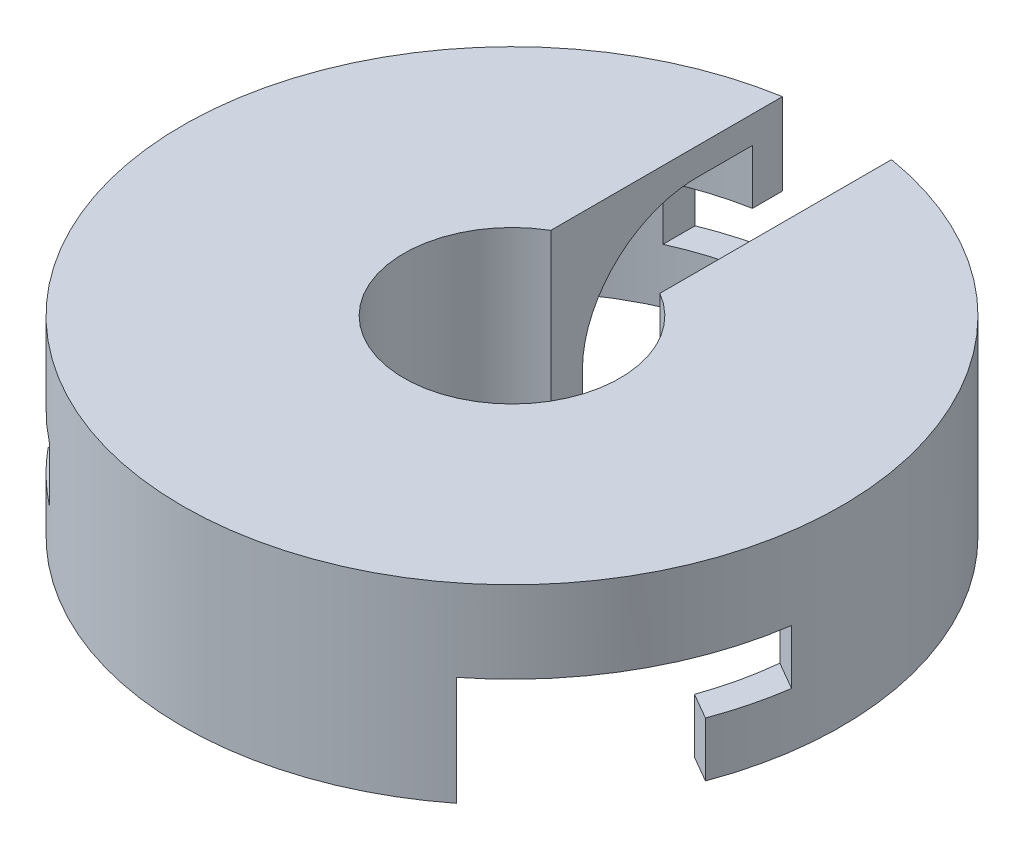
ISO-10303-21;
HEADER;
FILE_DESCRIPTION(('STEP AP214'),'2;1');
FILE_NAME('part.step','',(''),(''),'','','');
FILE_SCHEMA(('AUTOMOTIVE_DESIGN { 1 0 10303 214 1 1 1 1 }'));
ENDSEC;
DATA;
#1=APPLICATION_CONTEXT('core data for automotive mechanical design processes');
#2=APPLICATION_PROTOCOL_DEFINITION('international standard','automotive_design',2000,#1);
#3=PRODUCT_CONTEXT('',#1,'mechanical');
#4=PRODUCT('Part','Part','',(#3));
#5=PRODUCT_RELATED_PRODUCT_CATEGORY('part','',(#4));
#6=PRODUCT_DEFINITION_FORMATION('','',#4);
#7=PRODUCT_DEFINITION_CONTEXT('part definition',#1,'design');
#8=PRODUCT_DEFINITION('design','',#6,#7);
#9=PRODUCT_DEFINITION_SHAPE('','',#8);
#10=(LENGTH_UNIT() NAMED_UNIT(*) SI_UNIT(.MILLI.,.METRE.));
#11=(NAMED_UNIT(*) PLANE_ANGLE_UNIT() SI_UNIT($,.RADIAN.));
#12=(NAMED_UNIT(*) SI_UNIT($,.STERADIAN.) SOLID_ANGLE_UNIT());
#13=UNCERTAINTY_MEASURE_WITH_UNIT(LENGTH_MEASURE(1.E-05),#10,'distance_accuracy_value','');
#14=(GEOMETRIC_REPRESENTATION_CONTEXT(3) GLOBAL_UNCERTAINTY_ASSIGNED_CONTEXT((#13)) GLOBAL_UNIT_ASSIGNED_CONTEXT((#10,
#11,#12)) REPRESENTATION_CONTEXT('',''));
#15=CARTESIAN_POINT('',(0.,0.,0.));
#16=DIRECTION('',(0.,0.,1.));
#17=DIRECTION('',(1.,0.,0.));
#18=AXIS2_PLACEMENT_3D('',#15,#16,#17);
#19=CARTESIAN_POINT('',(-2.24999999999995,-7.,3.89711431702989));
#20=DIRECTION('',(0.5,0.,-0.866025403784439));
#21=DIRECTION('',(-0.866025403784439,0.,-0.5));
#22=AXIS2_PLACEMENT_3D('',#19,#20,#21);
#23=PLANE('',#22);
#24=DIRECTION('',(0.,1.,0.));
#25=VECTOR('',#24,1.);
#26=CARTESIAN_POINT('',(6.44266932535773,-7.,8.91582929200156));
#27=LINE('',#26,#25);
#28=CARTESIAN_POINT('',(6.44266932535773,-7.,8.91582929200156));
#29=VERTEX_POINT('',#28);
#30=CARTESIAN_POINT('',(6.44266932535773,-3.,8.91582929200156));
#31=VERTEX_POINT('',#30);
#32=EDGE_CURVE('E391',#29,#31,#27,.T.);
#33=ORIENTED_EDGE('',*,*,#32,.T.);
#34=DIRECTION('',(-0.866025403784439,0.,-0.5));
#35=VECTOR('',#34,1.);
#36=CARTESIAN_POINT('',(-2.24999999999995,-3.,3.89711431702989));
#37=LINE('',#36,#35);
#38=CARTESIAN_POINT('',(7.46078785093315,-3.,9.50364029680947));
#39=VERTEX_POINT('',#38);
#40=EDGE_CURVE('E288',#39,#31,#37,.T.);
#41=ORIENTED_EDGE('',*,*,#40,.F.);
#42=DIRECTION('',(0.,1.,0.));
#43=VECTOR('',#42,1.);
#44=CARTESIAN_POINT('',(7.46078785093315,-7.,9.50364029680947));
#45=LINE('',#44,#43);
#46=CARTESIAN_POINT('',(7.46078785093315,-7.,9.50364029680947));
#47=VERTEX_POINT('',#46);
#48=EDGE_CURVE('E393',#47,#39,#45,.T.);
#49=ORIENTED_EDGE('',*,*,#48,.F.);
#50=DIRECTION('',(-0.866025403784439,0.,-0.5));
#51=VECTOR('',#50,1.);
#52=CARTESIAN_POINT('',(-2.24999999999995,-7.,3.89711431702989));
#53=LINE('',#52,#51);
#54=EDGE_CURVE('E381',#47,#29,#53,.T.);
#55=ORIENTED_EDGE('',*,*,#54,.T.);
#56=EDGE_LOOP('',(#33,#41,#49,#55));
#57=FACE_BOUND('',#56,.T.);
#58=ADVANCED_FACE('F35',(#57),#23,.T.);
#59=CARTESIAN_POINT('',(2.25000000000006,-7.,-3.89711431703006));
#60=DIRECTION('',(0.500000000000001,0.,-0.866025403784438));
#61=DIRECTION('',(-0.866025403784438,0.,-0.500000000000001));
#62=AXIS2_PLACEMENT_3D('',#59,#60,#61);
#63=PLANE('',#62);
#64=DIRECTION('',(0.,1.,0.));
#65=VECTOR('',#64,1.);
#66=CARTESIAN_POINT('',(10.9426693253575,-7.,1.12160065794149));
#67=LINE('',#66,#65);
#68=CARTESIAN_POINT('',(10.9426693253575,-5.,1.12160065794149));
#69=VERTEX_POINT('',#68);
#70=CARTESIAN_POINT('',(10.9426693253575,-3.,1.12160065794149));
#71=VERTEX_POINT('',#70);
#72=EDGE_CURVE('E368',#69,#71,#67,.T.);
#73=ORIENTED_EDGE('',*,*,#72,.F.);
#74=DIRECTION('',(-0.866025403784438,0.,-0.500000000000001));
#75=VECTOR('',#74,1.);
#76=CARTESIAN_POINT('',(2.25000000000006,-5.,-3.89711431703006));
#77=LINE('',#76,#75);
#78=CARTESIAN_POINT('',(11.9607878509331,-5.,1.70941166274948));
#79=VERTEX_POINT('',#78);
#80=EDGE_CURVE('E263',#79,#69,#77,.T.);
#81=ORIENTED_EDGE('',*,*,#80,.F.);
#82=DIRECTION('',(0.,1.,0.));
#83=VECTOR('',#82,1.);
#84=CARTESIAN_POINT('',(11.9607878509331,-7.,1.70941166274948));
#85=LINE('',#84,#83);
#86=CARTESIAN_POINT('',(11.9607878509331,-3.,1.70941166274948));
#87=VERTEX_POINT('',#86);
#88=EDGE_CURVE('E367',#79,#87,#85,.T.);
#89=ORIENTED_EDGE('',*,*,#88,.T.);
#90=DIRECTION('',(-0.866025403784438,0.,-0.500000000000001));
#91=VECTOR('',#90,1.);
#92=CARTESIAN_POINT('',(2.25000000000006,-3.,-3.89711431703006));
#93=LINE('',#92,#91);
#94=EDGE_CURVE('E295',#87,#71,#93,.T.);
#95=ORIENTED_EDGE('',*,*,#94,.T.);
#96=EDGE_LOOP('',(#73,#81,#89,#95));
#97=FACE_BOUND('',#96,.T.);
#98=ADVANCED_FACE('F460',(#97),#63,.F.);
#99=CARTESIAN_POINT('',(2.25000000000045,-7.,3.89711431703076));
#100=DIRECTION('',(0.5,0.,0.866025403784439));
#101=DIRECTION('',(0.866025403784439,0.,-0.5));
#102=AXIS2_PLACEMENT_3D('',#99,#100,#101);
#103=PLANE('',#102);
#104=DIRECTION('',(0.,1.,0.));
#105=VECTOR('',#104,1.);
#106=CARTESIAN_POINT('',(-6.44266932535678,-7.,8.91582929200216));
#107=LINE('',#106,#105);
#108=CARTESIAN_POINT('',(-6.44266932535678,-5.,8.91582929200216));
#109=VERTEX_POINT('',#108);
#110=CARTESIAN_POINT('',(-6.44266932535678,-3.,8.91582929200216));
#111=VERTEX_POINT('',#110);
#112=EDGE_CURVE('E388',#109,#111,#107,.T.);
#113=ORIENTED_EDGE('',*,*,#112,.F.);
#114=DIRECTION('',(0.866025403784439,0.,-0.5));
#115=VECTOR('',#114,1.);
#116=CARTESIAN_POINT('',(2.25000000000045,-5.,3.89711431703076));
#117=LINE('',#116,#115);
#118=CARTESIAN_POINT('',(-7.4607878509323,-5.,9.50364029681013));
#119=VERTEX_POINT('',#118);
#120=EDGE_CURVE('E281',#119,#109,#117,.T.);
#121=ORIENTED_EDGE('',*,*,#120,.F.);
#122=DIRECTION('',(0.,1.,0.));
#123=VECTOR('',#122,1.);
#124=CARTESIAN_POINT('',(-7.4607878509323,-7.,9.50364029681013));
#125=LINE('',#124,#123);
#126=CARTESIAN_POINT('',(-7.4607878509323,-3.,9.50364029681013));
#127=VERTEX_POINT('',#126);
#128=EDGE_CURVE('E386',#119,#127,#125,.T.);
#129=ORIENTED_EDGE('',*,*,#128,.T.);
#130=DIRECTION('',(0.866025403784439,0.,-0.5));
#131=VECTOR('',#130,1.);
#132=CARTESIAN_POINT('',(2.25000000000045,-3.,3.89711431703076));
#133=LINE('',#132,#131);
#134=EDGE_CURVE('E307',#127,#111,#133,.T.);
#135=ORIENTED_EDGE('',*,*,#134,.T.);
#136=EDGE_LOOP('',(#113,#121,#129,#135));
#137=FACE_BOUND('',#136,.T.);
#138=ADVANCED_FACE('F466',(#137),#103,.F.);
#139=CARTESIAN_POINT('',(-2.24999999999955,-7.,-3.89711431702919));
#140=DIRECTION('',(0.5,0.,0.866025403784439));
#141=DIRECTION('',(0.866025403784439,0.,-0.5));
#142=AXIS2_PLACEMENT_3D('',#139,#140,#141);
#143=PLANE('',#142);
#144=DIRECTION('',(0.,1.,0.));
#145=VECTOR('',#144,1.);
#146=CARTESIAN_POINT('',(-10.942669325357,-7.,1.12160065794233));
#147=LINE('',#146,#145);
#148=CARTESIAN_POINT('',(-10.942669325357,-7.,1.12160065794233));
#149=VERTEX_POINT('',#148);
#150=CARTESIAN_POINT('',(-10.942669325357,-3.,1.12160065794233));
#151=VERTEX_POINT('',#150);
#152=EDGE_CURVE('E354',#149,#151,#147,.T.);
#153=ORIENTED_EDGE('',*,*,#152,.T.);
#154=DIRECTION('',(0.866025403784439,0.,-0.5));
#155=VECTOR('',#154,1.);
#156=CARTESIAN_POINT('',(-2.24999999999955,-3.,-3.89711431702919));
#157=LINE('',#156,#155);
#158=CARTESIAN_POINT('',(-11.9607878509329,-3.,1.70941166275055));
#159=VERTEX_POINT('',#158);
#160=EDGE_CURVE('E301',#159,#151,#157,.T.);
#161=ORIENTED_EDGE('',*,*,#160,.F.);
#162=DIRECTION('',(0.,1.,0.));
#163=VECTOR('',#162,1.);
#164=CARTESIAN_POINT('',(-11.9607878509329,-7.,1.70941166275055));
#165=LINE('',#164,#163);
#166=CARTESIAN_POINT('',(-11.9607878509329,-7.,1.70941166275055));
#167=VERTEX_POINT('',#166);
#168=EDGE_CURVE('E357',#167,#159,#165,.T.);
#169=ORIENTED_EDGE('',*,*,#168,.F.);
#170=DIRECTION('',(0.866025403784439,0.,-0.5));
#171=VECTOR('',#170,1.);
#172=CARTESIAN_POINT('',(-2.24999999999955,-7.,-3.89711431702919));
#173=LINE('',#172,#171);
#174=EDGE_CURVE('E225',#167,#149,#173,.T.);
#175=ORIENTED_EDGE('',*,*,#174,.T.);
#176=EDGE_LOOP('',(#153,#161,#169,#175));
#177=FACE_BOUND('',#176,.T.);
#178=ADVANCED_FACE('F478',(#177),#143,.T.);
#179=CARTESIAN_POINT('',(4.5,-7.,0.));
#180=DIRECTION('',(-1.,0.,0.));
#181=DIRECTION('',(0.,0.,1.));
#182=AXIS2_PLACEMENT_3D('',#179,#180,#181);
#183=PLANE('',#182);
#184=DIRECTION('',(0.,1.,0.));
#185=VECTOR('',#184,1.);
#186=CARTESIAN_POINT('',(4.5,-7.,-10.0374299499424));
#187=LINE('',#186,#185);
#188=CARTESIAN_POINT('',(4.5,-7.,-10.0374299499424));
#189=VERTEX_POINT('',#188);
#190=CARTESIAN_POINT('',(4.5,-3.,-10.0374299499424));
#191=VERTEX_POINT('',#190);
#192=EDGE_CURVE('E371',#189,#191,#187,.T.);
#193=ORIENTED_EDGE('',*,*,#192,.T.);
#194=DIRECTION('',(0.,0.,1.));
#195=VECTOR('',#194,1.);
#196=CARTESIAN_POINT('',(4.5,-3.,0.));
#197=LINE('',#196,#195);
#198=CARTESIAN_POINT('',(4.5,-3.,-11.2130519595591));
#199=VERTEX_POINT('',#198);
#200=EDGE_CURVE('E313',#199,#191,#197,.T.);
#201=ORIENTED_EDGE('',*,*,#200,.F.);
#202=DIRECTION('',(0.,1.,0.));
#203=VECTOR('',#202,1.);
#204=CARTESIAN_POINT('',(4.5,-7.,-11.2130519595591));
#205=LINE('',#204,#203);
#206=CARTESIAN_POINT('',(4.5,-7.,-11.2130519595591));
#207=VERTEX_POINT('',#206);
#208=EDGE_CURVE('E374',#207,#199,#205,.T.);
#209=ORIENTED_EDGE('',*,*,#208,.F.);
#210=DIRECTION('',(0.,0.,1.));
#211=VECTOR('',#210,1.);
#212=CARTESIAN_POINT('',(4.5,-7.,0.));
#213=LINE('',#212,#211);
#214=EDGE_CURVE('E362',#207,#189,#213,.T.);
#215=ORIENTED_EDGE('',*,*,#214,.T.);
#216=EDGE_LOOP('',(#193,#201,#209,#215));
#217=FACE_BOUND('',#216,.T.);
#218=ADVANCED_FACE('F505',(#217),#183,.T.);
#219=CARTESIAN_POINT('',(-4.5,-7.,0.));
#220=DIRECTION('',(-1.,0.,0.));
#221=DIRECTION('',(0.,0.,1.));
#222=AXIS2_PLACEMENT_3D('',#219,#220,#221);
#223=PLANE('',#222);
#224=DIRECTION('',(0.,1.,0.));
#225=VECTOR('',#224,1.);
#226=CARTESIAN_POINT('',(-4.5,-7.,-10.0374299499424));
#227=LINE('',#226,#225);
#228=CARTESIAN_POINT('',(-4.5,-5.,-10.0374299499424));
#229=VERTEX_POINT('',#228);
#230=CARTESIAN_POINT('',(-4.5,-3.,-10.0374299499424));
#231=VERTEX_POINT('',#230);
#232=EDGE_CURVE('E351',#229,#231,#227,.T.);
#233=ORIENTED_EDGE('',*,*,#232,.F.);
#234=DIRECTION('',(0.,0.,1.));
#235=VECTOR('',#234,1.);
#236=CARTESIAN_POINT('',(-4.5,-5.,0.));
#237=LINE('',#236,#235);
#238=CARTESIAN_POINT('',(-4.5,-5.,-11.2130519595591));
#239=VERTEX_POINT('',#238);
#240=EDGE_CURVE('E244',#239,#229,#237,.T.);
#241=ORIENTED_EDGE('',*,*,#240,.F.);
#242=DIRECTION('',(0.,1.,0.));
#243=VECTOR('',#242,1.);
#244=CARTESIAN_POINT('',(-4.5,-7.,-11.2130519595591));
#245=LINE('',#244,#243);
#246=CARTESIAN_POINT('',(-4.5,-3.,-11.2130519595591));
#247=VERTEX_POINT('',#246);
#248=EDGE_CURVE('E350',#239,#247,#245,.T.);
#249=ORIENTED_EDGE('',*,*,#248,.T.);
#250=DIRECTION('',(0.,0.,1.));
#251=VECTOR('',#250,1.);
#252=CARTESIAN_POINT('',(-4.5,-3.,0.));
#253=LINE('',#252,#251);
#254=EDGE_CURVE('E336',#247,#231,#253,.T.);
#255=ORIENTED_EDGE('',*,*,#254,.T.);
#256=EDGE_LOOP('',(#233,#241,#249,#255));
#257=FACE_BOUND('',#256,.T.);
#258=ADVANCED_FACE('F448',(#257),#223,.F.);
#259=CARTESIAN_POINT('',(0.,-7.,0.));
#260=DIRECTION('',(0.,1.,0.));
#261=DIRECTION('',(0.,0.,1.));
#262=AXIS2_PLACEMENT_3D('',#259,#260,#261);
#263=CYLINDRICAL_SURFACE('',#262,5.);
#264=DIRECTION('',(0.,1.,0.));
#265=VECTOR('',#264,1.);
#266=CARTESIAN_POINT('',(2.,-7.,-4.58257569495584));
#267=LINE('',#266,#265);
#268=CARTESIAN_POINT('',(2.,-7.,-4.58257569495584));
#269=VERTEX_POINT('',#268);
#270=CARTESIAN_POINT('',(2.,-5.,-4.58257569495584));
#271=VERTEX_POINT('',#270);
#272=EDGE_CURVE('E425',#269,#271,#267,.T.);
#273=ORIENTED_EDGE('',*,*,#272,.T.);
#274=CARTESIAN_POINT('',(0.,-5.,0.));
#275=DIRECTION('',(0.,1.,0.));
#276=DIRECTION('',(0.,0.,1.));
#277=AXIS2_PLACEMENT_3D('',#274,#275,#276);
#278=CIRCLE('',#277,5.);
#279=CARTESIAN_POINT('',(-2.,-5.,-4.58257569495584));
#280=VERTEX_POINT('',#279);
#281=EDGE_CURVE('E55',#271,#280,#278,.F.);
#282=ORIENTED_EDGE('',*,*,#281,.T.);
#283=DIRECTION('',(0.,1.,0.));
#284=VECTOR('',#283,1.);
#285=CARTESIAN_POINT('',(-2.,-7.,-4.58257569495584));
#286=LINE('',#285,#284);
#287=CARTESIAN_POINT('',(-2.,-7.,-4.58257569495584));
#288=VERTEX_POINT('',#287);
#289=EDGE_CURVE('E427',#288,#280,#286,.T.);
#290=ORIENTED_EDGE('',*,*,#289,.F.);
#291=CARTESIAN_POINT('',(0.,-7.,0.));
#292=DIRECTION('',(0.,1.,0.));
#293=DIRECTION('',(0.,0.,1.));
#294=AXIS2_PLACEMENT_3D('',#291,#292,#293);
#295=CIRCLE('',#294,5.);
#296=EDGE_CURVE('E409',#288,#269,#295,.T.);
#297=ORIENTED_EDGE('',*,*,#296,.T.);
#298=EDGE_LOOP('',(#273,#282,#290,#297));
#299=FACE_BOUND('',#298,.T.);
#300=ADVANCED_FACE('F446',(#299),#263,.T.);
#301=CARTESIAN_POINT('',(0.,-7.,0.));
#302=DIRECTION('',(0.,1.,0.));
#303=DIRECTION('',(0.,0.,1.));
#304=AXIS2_PLACEMENT_3D('',#301,#302,#303);
#305=CYLINDRICAL_SURFACE('',#304,3.96385270959813);
#306=CARTESIAN_POINT('',(0.,0.,0.));
#307=DIRECTION('',(0.,1.,0.));
#308=DIRECTION('',(0.,0.,1.));
#309=AXIS2_PLACEMENT_3D('',#306,#307,#308);
#310=CIRCLE('',#309,3.96385270959813);
#311=CARTESIAN_POINT('',(-2.,0.,-3.42229868705063));
#312=VERTEX_POINT('',#311);
#313=CARTESIAN_POINT('',(2.,0.,-3.42229868705063));
#314=VERTEX_POINT('',#313);
#315=EDGE_CURVE('E403',#312,#314,#310,.T.);
#316=ORIENTED_EDGE('',*,*,#315,.T.);
#317=DIRECTION('',(0.,1.,0.));
#318=VECTOR('',#317,1.);
#319=CARTESIAN_POINT('',(2.,-7.,-3.42229868705063));
#320=LINE('',#319,#318);
#321=CARTESIAN_POINT('',(2.,-7.,-3.42229868705063));
#322=VERTEX_POINT('',#321);
#323=EDGE_CURVE('E422',#322,#314,#320,.T.);
#324=ORIENTED_EDGE('',*,*,#323,.F.);
#325=CARTESIAN_POINT('',(0.,-7.,0.));
#326=DIRECTION('',(0.,1.,0.));
#327=DIRECTION('',(0.,0.,1.));
#328=AXIS2_PLACEMENT_3D('',#325,#326,#327);
#329=CIRCLE('',#328,3.96385270959813);
#330=CARTESIAN_POINT('',(-2.,-7.,-3.42229868705063));
#331=VERTEX_POINT('',#330);
#332=EDGE_CURVE('E404',#331,#322,#329,.T.);
#333=ORIENTED_EDGE('',*,*,#332,.F.);
#334=DIRECTION('',(0.,1.,0.));
#335=VECTOR('',#334,1.);
#336=CARTESIAN_POINT('',(-2.,-7.,-3.42229868705063));
#337=LINE('',#336,#335);
#338=EDGE_CURVE('E415',#331,#312,#337,.T.);
#339=ORIENTED_EDGE('',*,*,#338,.T.);
#340=EDGE_LOOP('',(#316,#324,#333,#339));
#341=FACE_BOUND('',#340,.T.);
#342=ADVANCED_FACE('F443',(#341),#305,.F.);
#343=CARTESIAN_POINT('',(2.,-7.,0.));
#344=DIRECTION('',(-1.,0.,0.));
#345=DIRECTION('',(0.,0.,1.));
#346=AXIS2_PLACEMENT_3D('',#343,#344,#345);
#347=PLANE('',#346);
#348=DIRECTION('',(0.,0.,1.));
#349=VECTOR('',#348,1.);
#350=CARTESIAN_POINT('',(2.,0.,0.));
#351=LINE('',#350,#349);
#352=CARTESIAN_POINT('',(2.,0.,-11.915642418593));
#353=VERTEX_POINT('',#352);
#354=EDGE_CURVE('E407',#353,#314,#351,.T.);
#355=ORIENTED_EDGE('',*,*,#354,.F.);
#356=DIRECTION('',(0.,1.,0.));
#357=VECTOR('',#356,1.);
#358=CARTESIAN_POINT('',(2.,-3.,-11.915642418593));
#359=LINE('',#358,#357);
#360=CARTESIAN_POINT('',(2.,-3.,-11.915642418593));
#361=VERTEX_POINT('',#360);
#362=EDGE_CURVE('E324',#361,#353,#359,.T.);
#363=ORIENTED_EDGE('',*,*,#362,.F.);
#364=DIRECTION('',(0.,0.,1.));
#365=VECTOR('',#364,1.);
#366=CARTESIAN_POINT('',(2.,-3.,0.));
#367=LINE('',#366,#365);
#368=CARTESIAN_POINT('',(2.,-3.,-10.816653826392));
#369=VERTEX_POINT('',#368);
#370=EDGE_CURVE('E319',#361,#369,#367,.T.);
#371=ORIENTED_EDGE('',*,*,#370,.T.);
#372=DIRECTION('',(0.,1.,0.));
#373=VECTOR('',#372,1.);
#374=CARTESIAN_POINT('',(2.,-3.,-10.816653826392));
#375=LINE('',#374,#373);
#376=CARTESIAN_POINT('',(2.,-1.,-10.816653826392));
#377=VERTEX_POINT('',#376);
#378=EDGE_CURVE('E325',#369,#377,#375,.T.);
#379=ORIENTED_EDGE('',*,*,#378,.T.);
#380=DIRECTION('',(0.,0.,1.));
#381=VECTOR('',#380,1.);
#382=CARTESIAN_POINT('',(2.,-1.,0.));
#383=LINE('',#382,#381);
#384=CARTESIAN_POINT('',(2.,-1.,-8.77496438739212));
#385=VERTEX_POINT('',#384);
#386=EDGE_CURVE('E401',#377,#385,#383,.T.);
#387=ORIENTED_EDGE('',*,*,#386,.T.);
#388=CARTESIAN_POINT('',(2.,-1.,-8.77496438739212));
#389=CARTESIAN_POINT('',(2.,-0.999989038284203,-8.6548613080865));
#390=CARTESIAN_POINT('',(2.,-1.00514200555115,-8.53476915947423));
#391=CARTESIAN_POINT('',(2.,-1.02562556718702,-8.29547271191291));
#392=CARTESIAN_POINT('',(2.,-1.04095466487312,-8.17626828500648));
#393=CARTESIAN_POINT('',(2.,-1.08161715375817,-7.93971234159698));
#394=CARTESIAN_POINT('',(2.,-1.10693912194012,-7.8223588679775));
#395=CARTESIAN_POINT('',(2.,-1.16733674113414,-7.59022109363343));
#396=CARTESIAN_POINT('',(2.,-1.20241256520061,-7.47543683853136));
#397=CARTESIAN_POINT('',(2.,-1.32188645831787,-7.1361342128175));
#398=CARTESIAN_POINT('',(2.,-1.42056728908463,-6.91645664180844));
#399=CARTESIAN_POINT('',(2.,-1.65305628603699,-6.49665117375229));
#400=CARTESIAN_POINT('',(2.,-1.78686940191909,-6.29652603685255));
#401=CARTESIAN_POINT('',(2.,-2.08730862890634,-5.91997185915772));
#402=CARTESIAN_POINT('',(2.,-2.25418754022837,-5.7437441961025));
#403=CARTESIAN_POINT('',(2.,-2.61606499407486,-5.42256542433835));
#404=CARTESIAN_POINT('',(2.,-2.81106900063312,-5.27762040679108));
#405=CARTESIAN_POINT('',(2.,-3.11769360116844,-5.08986860659322));
#406=CARTESIAN_POINT('',(2.,-3.22080205849948,-5.03279750368886));
#407=CARTESIAN_POINT('',(2.,-3.43169124680523,-4.928105012055));
#408=CARTESIAN_POINT('',(2.,-3.53946969851686,-4.8804790753791));
#409=CARTESIAN_POINT('',(2.,-3.75877409065451,-4.79533807648649));
#410=CARTESIAN_POINT('',(2.,-3.87029460541408,-4.75780903141751));
#411=CARTESIAN_POINT('',(2.,-4.09630230232903,-4.69331401187613));
#412=CARTESIAN_POINT('',(2.,-4.21078804234861,-4.66634300166707));
#413=CARTESIAN_POINT('',(2.,-4.43736269721964,-4.6241964392935));
#414=CARTESIAN_POINT('',(2.,-4.54937475644197,-4.60860759392369));
#415=CARTESIAN_POINT('',(2.,-4.77425396391292,-4.58778810100488));
#416=CARTESIAN_POINT('',(2.,-4.88712025301009,-4.58254815503079));
#417=CARTESIAN_POINT('',(2.,-5.,-4.58257569495584));
#418=B_SPLINE_CURVE_WITH_KNOTS('',3,(#388,#389,#390,#391,#392,#393,#394,#395,#396,#397,#398,
#399,#400,#401,#402,#403,#404,#405,#406,#407,#408,#409,#410,#411,#412,#413,#414,#415,#416,#417),
.UNSPECIFIED.,.F.,.F.,(4,2,2,2,2,2,2,2,2,2,2,2,2,2,4),(0.,0.360180961884622,0.720308960880402,
1.08002647850163,1.43975037869362,2.15856871849807,2.87748838514853,3.60213269994143,
4.32691798591356,4.68008218395451,5.03307591464084,5.38557824982074,5.73791225082748,
6.076712350934,6.41520790241061),.UNSPECIFIED.);
#419=EDGE_CURVE('E48',#385,#271,#418,.T.);
#420=ORIENTED_EDGE('',*,*,#419,.T.);
#421=ORIENTED_EDGE('',*,*,#272,.F.);
#422=DIRECTION('',(0.,0.,1.));
#423=VECTOR('',#422,1.);
#424=CARTESIAN_POINT('',(2.,-7.,0.));
#425=LINE('',#424,#423);
#426=EDGE_CURVE('E412',#269,#322,#425,.T.);
#427=ORIENTED_EDGE('',*,*,#426,.T.);
#428=ORIENTED_EDGE('',*,*,#323,.T.);
#429=EDGE_LOOP('',(#355,#363,#371,#379,#387,#420,#421,#427,#428));
#430=FACE_BOUND('',#429,.T.);
#431=ADVANCED_FACE('F437',(#430),#347,.T.);
#432=CARTESIAN_POINT('',(-2.,-7.,0.));
#433=DIRECTION('',(-1.,0.,0.));
#434=DIRECTION('',(0.,0.,1.));
#435=AXIS2_PLACEMENT_3D('',#432,#433,#434);
#436=PLANE('',#435);
#437=DIRECTION('',(0.,0.,1.));
#438=VECTOR('',#437,1.);
#439=CARTESIAN_POINT('',(-2.,0.,0.));
#440=LINE('',#439,#438);
#441=CARTESIAN_POINT('',(-2.,0.,-11.915642418593));
#442=VERTEX_POINT('',#441);
#443=EDGE_CURVE('E418',#442,#312,#440,.T.);
#444=ORIENTED_EDGE('',*,*,#443,.T.);
#445=ORIENTED_EDGE('',*,*,#338,.F.);
#446=DIRECTION('',(0.,0.,1.));
#447=VECTOR('',#446,1.);
#448=CARTESIAN_POINT('',(-2.,-7.,0.));
#449=LINE('',#448,#447);
#450=EDGE_CURVE('E406',#288,#331,#449,.T.);
#451=ORIENTED_EDGE('',*,*,#450,.F.);
#452=ORIENTED_EDGE('',*,*,#289,.T.);
#453=CARTESIAN_POINT('',(-2.,-5.,-4.58257569495584));
#454=CARTESIAN_POINT('',(-2.,-4.89284814326895,-4.58255388183688));
#455=CARTESIAN_POINT('',(-2.,-4.78570747189838,-4.58727293981974));
#456=CARTESIAN_POINT('',(-2.,-4.5722798954875,-4.60602479675881));
#457=CARTESIAN_POINT('',(-2.,-4.46599271075344,-4.62005440703123));
#458=CARTESIAN_POINT('',(-2.,-4.25541252025612,-4.65719195238039));
#459=CARTESIAN_POINT('',(-2.,-4.15111366963685,-4.68026669927404));
#460=CARTESIAN_POINT('',(-2.,-3.94487201581179,-4.73517228789201));
#461=CARTESIAN_POINT('',(-2.,-3.84292933751705,-4.767003592691));
#462=CARTESIAN_POINT('',(-2.,-3.54186766216568,-4.87502575637799));
#463=CARTESIAN_POINT('',(-2.,-3.34712187260199,-4.96381580045717));
#464=CARTESIAN_POINT('',(-2.,-2.97430669655332,-5.17131259459931));
#465=CARTESIAN_POINT('',(-2.,-2.79625121964462,-5.29004399877951));
#466=CARTESIAN_POINT('',(-2.,-2.4524580995803,-5.55985382185327));
#467=CARTESIAN_POINT('',(-2.,-2.28772558012259,-5.7122139205963));
#468=CARTESIAN_POINT('',(-2.,-1.98428706690616,-6.04094792830582));
#469=CARTESIAN_POINT('',(-2.,-1.8455875890693,-6.21732783028061));
#470=CARTESIAN_POINT('',(-2.,-1.58944083125828,-6.60127710493277));
#471=CARTESIAN_POINT('',(-2.,-1.47388776261319,-6.8101124761033));
#472=CARTESIAN_POINT('',(-2.,-1.27884380532628,-7.24395351032704));
#473=CARTESIAN_POINT('',(-2.,-1.19933998335082,-7.46895334046706));
#474=CARTESIAN_POINT('',(-2.,-1.09306599257723,-7.87440350291088));
#475=CARTESIAN_POINT('',(-2.,-1.05826757941042,-8.05279044116527));
#476=CARTESIAN_POINT('',(-2.,-1.0117203349536,-8.41240895727298));
#477=CARTESIAN_POINT('',(-2.,-0.999954759559046,-8.59363837205504));
#478=CARTESIAN_POINT('',(-2.,-1.,-8.77496438739212));
#479=B_SPLINE_CURVE_WITH_KNOTS('',3,(#453,#454,#455,#456,#457,#458,#459,#460,#461,#462,#463,
#464,#465,#466,#467,#468,#469,#470,#471,#472,#473,#474,#475,#476,#477,#478),.UNSPECIFIED.,.F.,
.F.,(4,2,2,2,2,2,2,2,2,2,2,2,4),(0.,0.321332977971845,0.642555962377951,0.962611192904016,
1.28268335222491,1.92164423703735,2.56113297860672,3.23139600172589,3.90182656479159,
4.61457773592713,5.32707299168141,5.87089510383189,6.41432172842725),.UNSPECIFIED.);
#480=CARTESIAN_POINT('',(-2.,-1.,-8.77496438739212));
#481=VERTEX_POINT('',#480);
#482=EDGE_CURVE('E11',#280,#481,#479,.T.);
#483=ORIENTED_EDGE('',*,*,#482,.T.);
#484=DIRECTION('',(0.,0.,1.));
#485=VECTOR('',#484,1.);
#486=CARTESIAN_POINT('',(-2.,-1.,0.));
#487=LINE('',#486,#485);
#488=CARTESIAN_POINT('',(-2.,-1.,-10.816653826392));
#489=VERTEX_POINT('',#488);
#490=EDGE_CURVE('E390',#489,#481,#487,.T.);
#491=ORIENTED_EDGE('',*,*,#490,.F.);
#492=DIRECTION('',(0.,1.,0.));
#493=VECTOR('',#492,1.);
#494=CARTESIAN_POINT('',(-2.,-3.,-10.816653826392));
#495=LINE('',#494,#493);
#496=CARTESIAN_POINT('',(-2.,-3.,-10.816653826392));
#497=VERTEX_POINT('',#496);
#498=EDGE_CURVE('E228',#497,#489,#495,.T.);
#499=ORIENTED_EDGE('',*,*,#498,.F.);
#500=DIRECTION('',(0.,0.,1.));
#501=VECTOR('',#500,1.);
#502=CARTESIAN_POINT('',(-2.,-3.,0.));
#503=LINE('',#502,#501);
#504=CARTESIAN_POINT('',(-2.,-3.,-11.915642418593));
#505=VERTEX_POINT('',#504);
#506=EDGE_CURVE('E328',#505,#497,#503,.T.);
#507=ORIENTED_EDGE('',*,*,#506,.F.);
#508=DIRECTION('',(0.,1.,0.));
#509=VECTOR('',#508,1.);
#510=CARTESIAN_POINT('',(-2.,-3.,-11.915642418593));
#511=LINE('',#510,#509);
#512=EDGE_CURVE('E342',#505,#442,#511,.T.);
#513=ORIENTED_EDGE('',*,*,#512,.T.);
#514=EDGE_LOOP('',(#444,#445,#451,#452,#483,#491,#499,#507,#513));
#515=FACE_BOUND('',#514,.T.);
#516=ADVANCED_FACE('F442',(#515),#436,.F.);
#517=CARTESIAN_POINT('',(0.,-7.,0.));
#518=DIRECTION('',(0.,1.,0.));
#519=DIRECTION('',(0.,0.,1.));
#520=AXIS2_PLACEMENT_3D('',#517,#518,#519);
#521=PLANE('',#520);
#522=ORIENTED_EDGE('',*,*,#332,.T.);
#523=ORIENTED_EDGE('',*,*,#426,.F.);
#524=ORIENTED_EDGE('',*,*,#296,.F.);
#525=ORIENTED_EDGE('',*,*,#450,.T.);
#526=EDGE_LOOP('',(#522,#523,#524,#525));
#527=FACE_BOUND('',#526,.T.);
#528=ADVANCED_FACE('F451',(#527),#521,.F.);
#529=CARTESIAN_POINT('',(0.,0.,0.));
#530=DIRECTION('',(0.,1.,0.));
#531=DIRECTION('',(0.,0.,1.));
#532=AXIS2_PLACEMENT_3D('',#529,#530,#531);
#533=PLANE('',#532);
#534=CARTESIAN_POINT('',(0.,0.,0.));
#535=DIRECTION('',(0.,1.,0.));
#536=DIRECTION('',(0.,0.,1.));
#537=AXIS2_PLACEMENT_3D('',#534,#535,#536);
#538=CIRCLE('',#537,12.0823232140087);
#539=EDGE_CURVE('E370',#442,#353,#538,.T.);
#540=ORIENTED_EDGE('',*,*,#539,.T.);
#541=ORIENTED_EDGE('',*,*,#354,.T.);
#542=ORIENTED_EDGE('',*,*,#315,.F.);
#543=ORIENTED_EDGE('',*,*,#443,.F.);
#544=EDGE_LOOP('',(#540,#541,#542,#543));
#545=FACE_BOUND('',#544,.T.);
#546=ADVANCED_FACE('F444',(#545),#533,.T.);
#547=CARTESIAN_POINT('',(0.,-1.,0.));
#548=DIRECTION('',(0.,1.,0.));
#549=DIRECTION('',(0.,0.,1.));
#550=AXIS2_PLACEMENT_3D('',#547,#548,#549);
#551=PLANE('',#550);
#552=ORIENTED_EDGE('',*,*,#490,.T.);
#553=CARTESIAN_POINT('',(0.,-1.,0.));
#554=DIRECTION('',(0.,1.,0.));
#555=DIRECTION('',(0.,0.,1.));
#556=AXIS2_PLACEMENT_3D('',#553,#554,#555);
#557=CIRCLE('',#556,9.);
#558=EDGE_CURVE('E424',#481,#385,#557,.T.);
#559=ORIENTED_EDGE('',*,*,#558,.T.);
#560=ORIENTED_EDGE('',*,*,#386,.F.);
#561=CARTESIAN_POINT('',(0.,-1.,0.));
#562=DIRECTION('',(0.,1.,0.));
#563=DIRECTION('',(0.,0.,1.));
#564=AXIS2_PLACEMENT_3D('',#561,#562,#563);
#565=CIRCLE('',#564,11.);
#566=EDGE_CURVE('E399',#489,#377,#565,.T.);
#567=ORIENTED_EDGE('',*,*,#566,.F.);
#568=EDGE_LOOP('',(#552,#559,#560,#567));
#569=FACE_BOUND('',#568,.T.);
#570=ADVANCED_FACE('F480',(#569),#551,.F.);
#571=CARTESIAN_POINT('',(0.,-7.,0.));
#572=DIRECTION('',(0.,1.,0.));
#573=DIRECTION('',(0.,0.,1.));
#574=AXIS2_PLACEMENT_3D('',#571,#572,#573);
#575=CYLINDRICAL_SURFACE('',#574,11.);
#576=CARTESIAN_POINT('',(0.,-7.,0.));
#577=DIRECTION('',(0.,1.,0.));
#578=DIRECTION('',(0.,0.,1.));
#579=AXIS2_PLACEMENT_3D('',#576,#577,#578);
#580=CIRCLE('',#579,11.);
#581=CARTESIAN_POINT('',(-8.36749699759746,-7.,7.14037772076503));
#582=VERTEX_POINT('',#581);
#583=EDGE_CURVE('E384',#582,#29,#580,.T.);
#584=ORIENTED_EDGE('',*,*,#583,.F.);
#585=DIRECTION('',(0.,1.,0.));
#586=VECTOR('',#585,1.);
#587=CARTESIAN_POINT('',(-8.36749699759746,-7.,7.14037772076503));
#588=LINE('',#587,#586);
#589=CARTESIAN_POINT('',(-8.36749699759746,-5.,7.14037772076503));
#590=VERTEX_POINT('',#589);
#591=EDGE_CURVE('E285',#582,#590,#588,.T.);
#592=ORIENTED_EDGE('',*,*,#591,.T.);
#593=CARTESIAN_POINT('',(0.,-5.,0.));
#594=DIRECTION('',(0.,1.,0.));
#595=DIRECTION('',(0.,0.,1.));
#596=AXIS2_PLACEMENT_3D('',#593,#594,#595);
#597=CIRCLE('',#596,11.);
#598=EDGE_CURVE('E276',#590,#109,#597,.T.);
#599=ORIENTED_EDGE('',*,*,#598,.T.);
#600=ORIENTED_EDGE('',*,*,#112,.T.);
#601=CARTESIAN_POINT('',(0.,-3.,0.));
#602=DIRECTION('',(0.,1.,0.));
#603=DIRECTION('',(0.,0.,1.));
#604=AXIS2_PLACEMENT_3D('',#601,#602,#603);
#605=CIRCLE('',#604,11.);
#606=EDGE_CURVE('E310',#151,#111,#605,.T.);
#607=ORIENTED_EDGE('',*,*,#606,.F.);
#608=ORIENTED_EDGE('',*,*,#152,.F.);
#609=CARTESIAN_POINT('',(0.,-7.,0.));
#610=DIRECTION('',(0.,1.,0.));
#611=DIRECTION('',(0.,0.,1.));
#612=AXIS2_PLACEMENT_3D('',#609,#610,#611);
#613=CIRCLE('',#612,11.);
#614=CARTESIAN_POINT('',(-2.,-7.,-10.816653826392));
#615=VERTEX_POINT('',#614);
#616=EDGE_CURVE('E348',#615,#149,#613,.T.);
#617=ORIENTED_EDGE('',*,*,#616,.F.);
#618=DIRECTION('',(0.,1.,0.));
#619=VECTOR('',#618,1.);
#620=CARTESIAN_POINT('',(-2.,-7.,-10.816653826392));
#621=LINE('',#620,#619);
#622=CARTESIAN_POINT('',(-2.,-5.,-10.816653826392));
#623=VERTEX_POINT('',#622);
#624=EDGE_CURVE('E238',#615,#623,#621,.T.);
#625=ORIENTED_EDGE('',*,*,#624,.T.);
#626=CARTESIAN_POINT('',(0.,-5.,0.));
#627=DIRECTION('',(0.,1.,0.));
#628=DIRECTION('',(0.,0.,1.));
#629=AXIS2_PLACEMENT_3D('',#626,#627,#628);
#630=CIRCLE('',#629,11.);
#631=EDGE_CURVE('E242',#623,#229,#630,.T.);
#632=ORIENTED_EDGE('',*,*,#631,.T.);
#633=ORIENTED_EDGE('',*,*,#232,.T.);
#634=CARTESIAN_POINT('',(0.,-3.,0.));
#635=DIRECTION('',(0.,1.,0.));
#636=DIRECTION('',(0.,0.,1.));
#637=AXIS2_PLACEMENT_3D('',#634,#635,#636);
#638=CIRCLE('',#637,11.);
#639=EDGE_CURVE('E339',#497,#231,#638,.T.);
#640=ORIENTED_EDGE('',*,*,#639,.F.);
#641=ORIENTED_EDGE('',*,*,#498,.T.);
#642=ORIENTED_EDGE('',*,*,#566,.T.);
#643=ORIENTED_EDGE('',*,*,#378,.F.);
#644=CARTESIAN_POINT('',(0.,-3.,0.));
#645=DIRECTION('',(0.,1.,0.));
#646=DIRECTION('',(0.,0.,1.));
#647=AXIS2_PLACEMENT_3D('',#644,#645,#646);
#648=CIRCLE('',#647,11.);
#649=EDGE_CURVE('E322',#191,#369,#648,.T.);
#650=ORIENTED_EDGE('',*,*,#649,.F.);
#651=ORIENTED_EDGE('',*,*,#192,.F.);
#652=CARTESIAN_POINT('',(0.,-7.,0.));
#653=DIRECTION('',(0.,1.,0.));
#654=DIRECTION('',(0.,0.,1.));
#655=AXIS2_PLACEMENT_3D('',#652,#653,#654);
#656=CIRCLE('',#655,11.);
#657=CARTESIAN_POINT('',(10.3674969975977,-7.,3.67627610562684));
#658=VERTEX_POINT('',#657);
#659=EDGE_CURVE('E365',#658,#189,#656,.T.);
#660=ORIENTED_EDGE('',*,*,#659,.F.);
#661=DIRECTION('',(0.,1.,0.));
#662=VECTOR('',#661,1.);
#663=CARTESIAN_POINT('',(10.3674969975977,-7.,3.67627610562684));
#664=LINE('',#663,#662);
#665=CARTESIAN_POINT('',(10.3674969975977,-5.,3.67627610562684));
#666=VERTEX_POINT('',#665);
#667=EDGE_CURVE('E267',#658,#666,#664,.T.);
#668=ORIENTED_EDGE('',*,*,#667,.T.);
#669=CARTESIAN_POINT('',(0.,-5.,0.));
#670=DIRECTION('',(0.,1.,0.));
#671=DIRECTION('',(0.,0.,1.));
#672=AXIS2_PLACEMENT_3D('',#669,#670,#671);
#673=CIRCLE('',#672,11.);
#674=EDGE_CURVE('E258',#666,#69,#673,.T.);
#675=ORIENTED_EDGE('',*,*,#674,.T.);
#676=ORIENTED_EDGE('',*,*,#72,.T.);
#677=CARTESIAN_POINT('',(0.,-3.,0.));
#678=DIRECTION('',(0.,1.,0.));
#679=DIRECTION('',(0.,0.,1.));
#680=AXIS2_PLACEMENT_3D('',#677,#678,#679);
#681=CIRCLE('',#680,11.);
#682=EDGE_CURVE('E298',#31,#71,#681,.T.);
#683=ORIENTED_EDGE('',*,*,#682,.F.);
#684=ORIENTED_EDGE('',*,*,#32,.F.);
#685=EDGE_LOOP('',(#584,#592,#599,#600,#607,#608,#617,#625,#632,#633,#640,#641,#642,#643,#650,
#651,#660,#668,#675,#676,#683,#684));
#686=FACE_BOUND('',#685,.T.);
#687=ADVANCED_FACE('F471',(#686),#575,.F.);
#688=CARTESIAN_POINT('',(0.,-7.,0.));
#689=DIRECTION('',(0.,1.,0.));
#690=DIRECTION('',(0.,0.,1.));
#691=AXIS2_PLACEMENT_3D('',#688,#689,#690);
#692=CYLINDRICAL_SURFACE('',#691,12.0823232140087);
#693=ORIENTED_EDGE('',*,*,#539,.F.);
#694=ORIENTED_EDGE('',*,*,#512,.F.);
#695=CARTESIAN_POINT('',(0.,-3.,0.));
#696=DIRECTION('',(0.,1.,0.));
#697=DIRECTION('',(0.,0.,1.));
#698=AXIS2_PLACEMENT_3D('',#695,#696,#697);
#699=CIRCLE('',#698,12.0823232140087);
#700=EDGE_CURVE('E333',#505,#247,#699,.T.);
#701=ORIENTED_EDGE('',*,*,#700,.T.);
#702=ORIENTED_EDGE('',*,*,#248,.F.);
#703=CARTESIAN_POINT('',(0.,-5.,0.));
#704=DIRECTION('',(0.,1.,0.));
#705=DIRECTION('',(0.,0.,1.));
#706=AXIS2_PLACEMENT_3D('',#703,#704,#705);
#707=CIRCLE('',#706,12.0823232140087);
#708=CARTESIAN_POINT('',(-2.,-5.,-11.915642418593));
#709=VERTEX_POINT('',#708);
#710=EDGE_CURVE('E234',#709,#239,#707,.T.);
#711=ORIENTED_EDGE('',*,*,#710,.F.);
#712=DIRECTION('',(0.,1.,0.));
#713=VECTOR('',#712,1.);
#714=CARTESIAN_POINT('',(-2.,-7.,-11.915642418593));
#715=LINE('',#714,#713);
#716=CARTESIAN_POINT('',(-2.,-7.,-11.915642418593));
#717=VERTEX_POINT('',#716);
#718=EDGE_CURVE('E231',#717,#709,#715,.T.);
#719=ORIENTED_EDGE('',*,*,#718,.F.);
#720=CARTESIAN_POINT('',(0.,-7.,0.));
#721=DIRECTION('',(0.,1.,0.));
#722=DIRECTION('',(0.,0.,1.));
#723=AXIS2_PLACEMENT_3D('',#720,#721,#722);
#724=CIRCLE('',#723,12.0823232140087);
#725=EDGE_CURVE('E218',#717,#167,#724,.T.);
#726=ORIENTED_EDGE('',*,*,#725,.T.);
#727=ORIENTED_EDGE('',*,*,#168,.T.);
#728=CARTESIAN_POINT('',(0.,-3.,0.));
#729=DIRECTION('',(0.,1.,0.));
#730=DIRECTION('',(0.,0.,1.));
#731=AXIS2_PLACEMENT_3D('',#728,#729,#730);
#732=CIRCLE('',#731,12.0823232140087);
#733=EDGE_CURVE('E304',#159,#127,#732,.T.);
#734=ORIENTED_EDGE('',*,*,#733,.T.);
#735=ORIENTED_EDGE('',*,*,#128,.F.);
#736=CARTESIAN_POINT('',(0.,-5.,0.));
#737=DIRECTION('',(0.,1.,0.));
#738=DIRECTION('',(0.,0.,1.));
#739=AXIS2_PLACEMENT_3D('',#736,#737,#738);
#740=CIRCLE('',#739,12.0823232140087);
#741=CARTESIAN_POINT('',(-9.31924903691269,-5.,7.68987201686545));
#742=VERTEX_POINT('',#741);
#743=EDGE_CURVE('E279',#742,#119,#740,.T.);
#744=ORIENTED_EDGE('',*,*,#743,.F.);
#745=DIRECTION('',(0.,1.,0.));
#746=VECTOR('',#745,1.);
#747=CARTESIAN_POINT('',(-9.31924903691269,-7.,7.68987201686545));
#748=LINE('',#747,#746);
#749=CARTESIAN_POINT('',(-9.31924903691269,-7.,7.68987201686545));
#750=VERTEX_POINT('',#749);
#751=EDGE_CURVE('E275',#750,#742,#748,.T.);
#752=ORIENTED_EDGE('',*,*,#751,.F.);
#753=CARTESIAN_POINT('',(0.,-7.,0.));
#754=DIRECTION('',(0.,1.,0.));
#755=DIRECTION('',(0.,0.,1.));
#756=AXIS2_PLACEMENT_3D('',#753,#754,#755);
#757=CIRCLE('',#756,12.0823232140087);
#758=EDGE_CURVE('E378',#750,#47,#757,.T.);
#759=ORIENTED_EDGE('',*,*,#758,.T.);
#760=ORIENTED_EDGE('',*,*,#48,.T.);
#761=CARTESIAN_POINT('',(0.,-3.,0.));
#762=DIRECTION('',(0.,1.,0.));
#763=DIRECTION('',(0.,0.,1.));
#764=AXIS2_PLACEMENT_3D('',#761,#762,#763);
#765=CIRCLE('',#764,12.0823232140087);
#766=EDGE_CURVE('E292',#39,#87,#765,.T.);
#767=ORIENTED_EDGE('',*,*,#766,.T.);
#768=ORIENTED_EDGE('',*,*,#88,.F.);
#769=CARTESIAN_POINT('',(0.,-5.,0.));
#770=DIRECTION('',(0.,1.,0.));
#771=DIRECTION('',(0.,0.,1.));
#772=AXIS2_PLACEMENT_3D('',#769,#770,#771);
#773=CIRCLE('',#772,12.0823232140087);
#774=CARTESIAN_POINT('',(11.3192490369132,-5.,4.22577040172741));
#775=VERTEX_POINT('',#774);
#776=EDGE_CURVE('E261',#775,#79,#773,.T.);
#777=ORIENTED_EDGE('',*,*,#776,.F.);
#778=DIRECTION('',(0.,1.,0.));
#779=VECTOR('',#778,1.);
#780=CARTESIAN_POINT('',(11.3192490369132,-7.,4.22577040172741));
#781=LINE('',#780,#779);
#782=CARTESIAN_POINT('',(11.3192490369132,-7.,4.22577040172741));
#783=VERTEX_POINT('',#782);
#784=EDGE_CURVE('E257',#783,#775,#781,.T.);
#785=ORIENTED_EDGE('',*,*,#784,.F.);
#786=CARTESIAN_POINT('',(0.,-7.,0.));
#787=DIRECTION('',(0.,1.,0.));
#788=DIRECTION('',(0.,0.,1.));
#789=AXIS2_PLACEMENT_3D('',#786,#787,#788);
#790=CIRCLE('',#789,12.0823232140087);
#791=EDGE_CURVE('E353',#783,#207,#790,.T.);
#792=ORIENTED_EDGE('',*,*,#791,.T.);
#793=ORIENTED_EDGE('',*,*,#208,.T.);
#794=CARTESIAN_POINT('',(0.,-3.,0.));
#795=DIRECTION('',(0.,1.,0.));
#796=DIRECTION('',(0.,0.,1.));
#797=AXIS2_PLACEMENT_3D('',#794,#795,#796);
#798=CIRCLE('',#797,12.0823232140087);
#799=EDGE_CURVE('E316',#199,#361,#798,.T.);
#800=ORIENTED_EDGE('',*,*,#799,.T.);
#801=ORIENTED_EDGE('',*,*,#362,.T.);
#802=EDGE_LOOP('',(#693,#694,#701,#702,#711,#719,#726,#727,#734,#735,#744,#752,#759,#760,#767,
#768,#777,#785,#792,#793,#800,#801));
#803=FACE_BOUND('',#802,.T.);
#804=ADVANCED_FACE('F232',(#803),#692,.T.);
#805=CARTESIAN_POINT('',(0.,-7.,0.));
#806=DIRECTION('',(0.,1.,0.));
#807=DIRECTION('',(0.,0.,1.));
#808=AXIS2_PLACEMENT_3D('',#805,#806,#807);
#809=PLANE('',#808);
#810=ORIENTED_EDGE('',*,*,#758,.F.);
#811=DIRECTION('',(0.866025403784438,0.,-0.5));
#812=VECTOR('',#811,1.);
#813=CARTESIAN_POINT('',(1.00000000000011,-7.,1.73205080756906));
#814=LINE('',#813,#812);
#815=EDGE_CURVE('E272',#750,#582,#814,.T.);
#816=ORIENTED_EDGE('',*,*,#815,.T.);
#817=ORIENTED_EDGE('',*,*,#583,.T.);
#818=ORIENTED_EDGE('',*,*,#54,.F.);
#819=EDGE_LOOP('',(#810,#816,#817,#818));
#820=FACE_BOUND('',#819,.T.);
#821=ADVANCED_FACE('F475',(#820),#809,.F.);
#822=CARTESIAN_POINT('',(0.,-7.,0.));
#823=DIRECTION('',(0.,1.,0.));
#824=DIRECTION('',(0.,0.,1.));
#825=AXIS2_PLACEMENT_3D('',#822,#823,#824);
#826=PLANE('',#825);
#827=ORIENTED_EDGE('',*,*,#791,.F.);
#828=DIRECTION('',(-0.866025403784439,0.,-0.5));
#829=VECTOR('',#828,1.);
#830=CARTESIAN_POINT('',(1.00000000000014,-7.,-1.73205080756912));
#831=LINE('',#830,#829);
#832=EDGE_CURVE('E254',#783,#658,#831,.T.);
#833=ORIENTED_EDGE('',*,*,#832,.T.);
#834=ORIENTED_EDGE('',*,*,#659,.T.);
#835=ORIENTED_EDGE('',*,*,#214,.F.);
#836=EDGE_LOOP('',(#827,#833,#834,#835));
#837=FACE_BOUND('',#836,.T.);
#838=ADVANCED_FACE('F564',(#837),#826,.F.);
#839=CARTESIAN_POINT('',(0.,-7.,0.));
#840=DIRECTION('',(0.,1.,0.));
#841=DIRECTION('',(0.,0.,1.));
#842=AXIS2_PLACEMENT_3D('',#839,#840,#841);
#843=PLANE('',#842);
#844=ORIENTED_EDGE('',*,*,#725,.F.);
#845=DIRECTION('',(0.,0.,1.));
#846=VECTOR('',#845,1.);
#847=CARTESIAN_POINT('',(-2.,-7.,0.));
#848=LINE('',#847,#846);
#849=EDGE_CURVE('E222',#717,#615,#848,.T.);
#850=ORIENTED_EDGE('',*,*,#849,.T.);
#851=ORIENTED_EDGE('',*,*,#616,.T.);
#852=ORIENTED_EDGE('',*,*,#174,.F.);
#853=EDGE_LOOP('',(#844,#850,#851,#852));
#854=FACE_BOUND('',#853,.T.);
#855=ADVANCED_FACE('F220',(#854),#843,.F.);
#856=CARTESIAN_POINT('',(0.,-3.,0.));
#857=DIRECTION('',(0.,1.,0.));
#858=DIRECTION('',(0.,0.,1.));
#859=AXIS2_PLACEMENT_3D('',#856,#857,#858);
#860=PLANE('',#859);
#861=ORIENTED_EDGE('',*,*,#506,.T.);
#862=ORIENTED_EDGE('',*,*,#639,.T.);
#863=ORIENTED_EDGE('',*,*,#254,.F.);
#864=ORIENTED_EDGE('',*,*,#700,.F.);
#865=EDGE_LOOP('',(#861,#862,#863,#864));
#866=FACE_BOUND('',#865,.T.);
#867=ADVANCED_FACE('F520',(#866),#860,.F.);
#868=CARTESIAN_POINT('',(0.,-3.,0.));
#869=DIRECTION('',(0.,1.,0.));
#870=DIRECTION('',(0.,0.,1.));
#871=AXIS2_PLACEMENT_3D('',#868,#869,#870);
#872=PLANE('',#871);
#873=ORIENTED_EDGE('',*,*,#200,.T.);
#874=ORIENTED_EDGE('',*,*,#649,.T.);
#875=ORIENTED_EDGE('',*,*,#370,.F.);
#876=ORIENTED_EDGE('',*,*,#799,.F.);
#877=EDGE_LOOP('',(#873,#874,#875,#876));
#878=FACE_BOUND('',#877,.T.);
#879=ADVANCED_FACE('F503',(#878),#872,.F.);
#880=CARTESIAN_POINT('',(0.,-3.,0.));
#881=DIRECTION('',(0.,1.,0.));
#882=DIRECTION('',(0.,0.,1.));
#883=AXIS2_PLACEMENT_3D('',#880,#881,#882);
#884=PLANE('',#883);
#885=ORIENTED_EDGE('',*,*,#160,.T.);
#886=ORIENTED_EDGE('',*,*,#606,.T.);
#887=ORIENTED_EDGE('',*,*,#134,.F.);
#888=ORIENTED_EDGE('',*,*,#733,.F.);
#889=EDGE_LOOP('',(#885,#886,#887,#888));
#890=FACE_BOUND('',#889,.T.);
#891=ADVANCED_FACE('F532',(#890),#884,.F.);
#892=CARTESIAN_POINT('',(0.,-3.,0.));
#893=DIRECTION('',(0.,1.,0.));
#894=DIRECTION('',(0.,0.,1.));
#895=AXIS2_PLACEMENT_3D('',#892,#893,#894);
#896=PLANE('',#895);
#897=ORIENTED_EDGE('',*,*,#40,.T.);
#898=ORIENTED_EDGE('',*,*,#682,.T.);
#899=ORIENTED_EDGE('',*,*,#94,.F.);
#900=ORIENTED_EDGE('',*,*,#766,.F.);
#901=EDGE_LOOP('',(#897,#898,#899,#900));
#902=FACE_BOUND('',#901,.T.);
#903=ADVANCED_FACE('F551',(#902),#896,.F.);
#904=CARTESIAN_POINT('',(1.00000000000011,-7.,1.73205080756906));
#905=DIRECTION('',(0.5,0.,0.866025403784438));
#906=DIRECTION('',(0.866025403784438,0.,-0.5));
#907=AXIS2_PLACEMENT_3D('',#904,#905,#906);
#908=PLANE('',#907);
#909=DIRECTION('',(0.866025403784438,0.,-0.5));
#910=VECTOR('',#909,1.);
#911=CARTESIAN_POINT('',(1.00000000000011,-5.,1.73205080756906));
#912=LINE('',#911,#910);
#913=EDGE_CURVE('E270',#742,#590,#912,.T.);
#914=ORIENTED_EDGE('',*,*,#913,.T.);
#915=ORIENTED_EDGE('',*,*,#591,.F.);
#916=ORIENTED_EDGE('',*,*,#815,.F.);
#917=ORIENTED_EDGE('',*,*,#751,.T.);
#918=EDGE_LOOP('',(#914,#915,#916,#917));
#919=FACE_BOUND('',#918,.T.);
#920=ADVANCED_FACE('F542',(#919),#908,.F.);
#921=CARTESIAN_POINT('',(0.,-5.,0.));
#922=DIRECTION('',(0.,1.,0.));
#923=DIRECTION('',(0.,0.,1.));
#924=AXIS2_PLACEMENT_3D('',#921,#922,#923);
#925=PLANE('',#924);
#926=ORIENTED_EDGE('',*,*,#913,.F.);
#927=ORIENTED_EDGE('',*,*,#743,.T.);
#928=ORIENTED_EDGE('',*,*,#120,.T.);
#929=ORIENTED_EDGE('',*,*,#598,.F.);
#930=EDGE_LOOP('',(#926,#927,#928,#929));
#931=FACE_BOUND('',#930,.T.);
#932=ADVANCED_FACE('F537',(#931),#925,.T.);
#933=CARTESIAN_POINT('',(1.00000000000014,-7.,-1.73205080756912));
#934=DIRECTION('',(0.5,0.,-0.866025403784439));
#935=DIRECTION('',(-0.866025403784439,0.,-0.5));
#936=AXIS2_PLACEMENT_3D('',#933,#934,#935);
#937=PLANE('',#936);
#938=DIRECTION('',(-0.866025403784439,0.,-0.5));
#939=VECTOR('',#938,1.);
#940=CARTESIAN_POINT('',(1.00000000000014,-5.,-1.73205080756912));
#941=LINE('',#940,#939);
#942=EDGE_CURVE('E252',#775,#666,#941,.T.);
#943=ORIENTED_EDGE('',*,*,#942,.T.);
#944=ORIENTED_EDGE('',*,*,#667,.F.);
#945=ORIENTED_EDGE('',*,*,#832,.F.);
#946=ORIENTED_EDGE('',*,*,#784,.T.);
#947=EDGE_LOOP('',(#943,#944,#945,#946));
#948=FACE_BOUND('',#947,.T.);
#949=ADVANCED_FACE('F562',(#948),#937,.F.);
#950=CARTESIAN_POINT('',(0.,-5.,0.));
#951=DIRECTION('',(0.,1.,0.));
#952=DIRECTION('',(0.,0.,1.));
#953=AXIS2_PLACEMENT_3D('',#950,#951,#952);
#954=PLANE('',#953);
#955=ORIENTED_EDGE('',*,*,#942,.F.);
#956=ORIENTED_EDGE('',*,*,#776,.T.);
#957=ORIENTED_EDGE('',*,*,#80,.T.);
#958=ORIENTED_EDGE('',*,*,#674,.F.);
#959=EDGE_LOOP('',(#955,#956,#957,#958));
#960=FACE_BOUND('',#959,.T.);
#961=ADVANCED_FACE('F559',(#960),#954,.T.);
#962=CARTESIAN_POINT('',(-2.,-7.,0.));
#963=DIRECTION('',(-1.,0.,0.));
#964=DIRECTION('',(0.,0.,1.));
#965=AXIS2_PLACEMENT_3D('',#962,#963,#964);
#966=PLANE('',#965);
#967=DIRECTION('',(0.,0.,1.));
#968=VECTOR('',#967,1.);
#969=CARTESIAN_POINT('',(-2.,-5.,0.));
#970=LINE('',#969,#968);
#971=EDGE_CURVE('E247',#709,#623,#970,.T.);
#972=ORIENTED_EDGE('',*,*,#971,.T.);
#973=ORIENTED_EDGE('',*,*,#624,.F.);
#974=ORIENTED_EDGE('',*,*,#849,.F.);
#975=ORIENTED_EDGE('',*,*,#718,.T.);
#976=EDGE_LOOP('',(#972,#973,#974,#975));
#977=FACE_BOUND('',#976,.T.);
#978=ADVANCED_FACE('F240',(#977),#966,.F.);
#979=CARTESIAN_POINT('',(0.,-5.,0.));
#980=DIRECTION('',(0.,1.,0.));
#981=DIRECTION('',(0.,0.,1.));
#982=AXIS2_PLACEMENT_3D('',#979,#980,#981);
#983=PLANE('',#982);
#984=ORIENTED_EDGE('',*,*,#971,.F.);
#985=ORIENTED_EDGE('',*,*,#710,.T.);
#986=ORIENTED_EDGE('',*,*,#240,.T.);
#987=ORIENTED_EDGE('',*,*,#631,.F.);
#988=EDGE_LOOP('',(#984,#985,#986,#987));
#989=FACE_BOUND('',#988,.T.);
#990=ADVANCED_FACE('F524',(#989),#983,.T.);
#991=CARTESIAN_POINT('',(0.,-5.,0.));
#992=DIRECTION('',(0.,1.,0.));
#993=DIRECTION('',(0.,0.,1.));
#994=AXIS2_PLACEMENT_3D('',#991,#992,#993);
#995=TOROIDAL_SURFACE('',#994,9.,4.);
#996=ORIENTED_EDGE('',*,*,#482,.F.);
#997=ORIENTED_EDGE('',*,*,#281,.F.);
#998=ORIENTED_EDGE('',*,*,#419,.F.);
#999=ORIENTED_EDGE('',*,*,#558,.F.);
#1000=EDGE_LOOP('',(#996,#997,#998,#999));
#1001=FACE_BOUND('',#1000,.T.);
#1002=ADVANCED_FACE('F37',(#1001),#995,.F.);
#1003=CLOSED_SHELL('',(#58,#98,#138,#178,#218,#258,#300,#342,#431,#516,#528,#546,#570,#687,#804,
#821,#838,#855,#867,#879,#891,#903,#920,#932,#949,#961,#978,#990,#1002));
#1004=MANIFOLD_SOLID_BREP('B2',#1003);
#1005=ADVANCED_BREP_SHAPE_REPRESENTATION('',(#18,#1004),#14);
#1006=SHAPE_DEFINITION_REPRESENTATION(#9,#1005);
ENDSEC;
END-ISO-10303-21;
